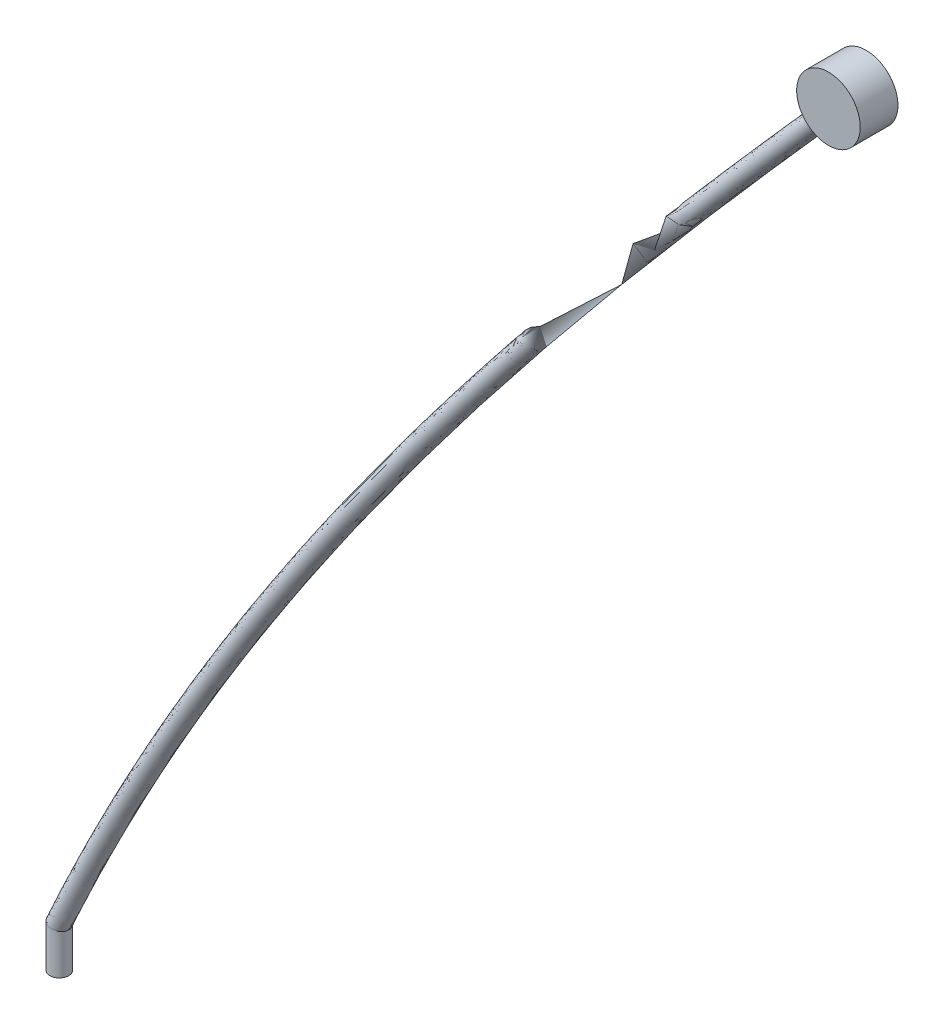
ISO-10303-21;
HEADER;
FILE_DESCRIPTION(('STEP AP214'),'2;1');
FILE_NAME('part.step','',(''),(''),'','','');
FILE_SCHEMA(('AUTOMOTIVE_DESIGN { 1 0 10303 214 1 1 1 1 }'));
ENDSEC;
DATA;
#1=APPLICATION_CONTEXT('core data for automotive mechanical design processes');
#2=APPLICATION_PROTOCOL_DEFINITION('international standard','automotive_design',2000,#1);
#3=PRODUCT_CONTEXT('',#1,'mechanical');
#4=PRODUCT('Part','Part','',(#3));
#5=PRODUCT_RELATED_PRODUCT_CATEGORY('part','',(#4));
#6=PRODUCT_DEFINITION_FORMATION('','',#4);
#7=PRODUCT_DEFINITION_CONTEXT('part definition',#1,'design');
#8=PRODUCT_DEFINITION('design','',#6,#7);
#9=PRODUCT_DEFINITION_SHAPE('','',#8);
#10=(LENGTH_UNIT() NAMED_UNIT(*) SI_UNIT(.MILLI.,.METRE.));
#11=(NAMED_UNIT(*) PLANE_ANGLE_UNIT() SI_UNIT($,.RADIAN.));
#12=(NAMED_UNIT(*) SI_UNIT($,.STERADIAN.) SOLID_ANGLE_UNIT());
#13=UNCERTAINTY_MEASURE_WITH_UNIT(LENGTH_MEASURE(1.E-05),#10,'distance_accuracy_value','');
#14=(GEOMETRIC_REPRESENTATION_CONTEXT(3) GLOBAL_UNCERTAINTY_ASSIGNED_CONTEXT((#13)) GLOBAL_UNIT_ASSIGNED_CONTEXT((#10,
#11,#12)) REPRESENTATION_CONTEXT('',''));
#15=CARTESIAN_POINT('',(0.,0.,0.));
#16=DIRECTION('',(0.,0.,1.));
#17=DIRECTION('',(1.,0.,0.));
#18=AXIS2_PLACEMENT_3D('',#15,#16,#17);
#19=CARTESIAN_POINT('',(0.364982395747233,-0.40582418897489,0.));
#20=CARTESIAN_POINT('',(0.395112045346233,-0.339378505646708,0.));
#21=CARTESIAN_POINT('',(0.425299373130601,-0.272805285519978,0.));
#22=CARTESIAN_POINT('',(2.8912381570119,5.16536460882118,0.));
#23=CARTESIAN_POINT('',(5.67835668781732,10.3421385702397,0.));
#24=CARTESIAN_POINT('',(11.8051688985683,20.4175561670656,0.));
#25=CARTESIAN_POINT('',(15.1401645123964,25.3058525147053,0.));
#26=CARTESIAN_POINT('',(25.691584849806,39.597036609414,0.));
#27=CARTESIAN_POINT('',(33.4545155288597,48.625971156513,0.));
#28=CARTESIAN_POINT('',(41.2279620924617,57.3565721666016,0.));
#29=CARTESIAN_POINT('',(0.36498239574723,-0.405824188974876,0.999999999999999));
#30=CARTESIAN_POINT('',(0.395112045346229,-0.339378505646694,0.999999999999999));
#31=CARTESIAN_POINT('',(0.425299373130598,-0.272805285519964,0.999999999999999));
#32=CARTESIAN_POINT('',(2.8912381570119,5.16536460882119,0.999999999999999));
#33=CARTESIAN_POINT('',(5.67835668781732,10.3421385702397,0.999999999999999));
#34=CARTESIAN_POINT('',(11.8051688985683,20.4175561670656,0.999999999999999));
#35=CARTESIAN_POINT('',(15.1401645123964,25.3058525147053,0.999999999999999));
#36=CARTESIAN_POINT('',(25.691584849806,39.597036609414,0.999999999999999));
#37=CARTESIAN_POINT('',(33.4545155288597,48.625971156513,0.999999999999999));
#38=CARTESIAN_POINT('',(41.2279620924617,57.3565721666016,0.999999999999999));
#39=CARTESIAN_POINT('',(-0.545760293342953,0.00715008899987435,0.999999999999999));
#40=CARTESIAN_POINT('',(-0.515630643743954,0.0735957723280567,0.999999999999999));
#41=CARTESIAN_POINT('',(-0.485558923687537,0.139914042390566,0.999999999999999));
#42=CARTESIAN_POINT('',(1.98985983661907,5.59899015676793,0.999999999999999));
#43=CARTESIAN_POINT('',(4.80573824831753,10.8317945789587,0.999999999999999));
#44=CARTESIAN_POINT('',(10.9689346025964,20.9670451571175,0.999999999999999));
#45=CARTESIAN_POINT('',(14.3209302517658,25.8798486066753,0.999999999999999));
#46=CARTESIAN_POINT('',(24.9165865728638,40.2309473448191,0.999999999999999));
#47=CARTESIAN_POINT('',(32.6998441616535,49.2821792741472,0.999999999999999));
#48=CARTESIAN_POINT('',(40.481101513256,58.0215528243869,0.999999999999999));
#49=CARTESIAN_POINT('',(-0.545760293342953,0.00715008899987435,0.));
#50=CARTESIAN_POINT('',(-0.515630643743954,0.0735957723280567,0.));
#51=CARTESIAN_POINT('',(-0.485558923687537,0.139914042390566,0.));
#52=CARTESIAN_POINT('',(1.98985983661907,5.59899015676793,0.));
#53=CARTESIAN_POINT('',(4.80573824831753,10.8317945789587,0.));
#54=CARTESIAN_POINT('',(10.9689346025964,20.9670451571175,0.));
#55=CARTESIAN_POINT('',(14.3209302517658,25.8798486066753,0.));
#56=CARTESIAN_POINT('',(24.9165865728638,40.2309473448191,0.));
#57=CARTESIAN_POINT('',(32.6998441616535,49.2821792741472,0.));
#58=CARTESIAN_POINT('',(40.481101513256,58.0215528243869,0.));
#59=CARTESIAN_POINT('',(-0.545760293342953,0.00715008899987435,-0.999999999999999));
#60=CARTESIAN_POINT('',(-0.515630643743954,0.0735957723280567,-0.999999999999999));
#61=CARTESIAN_POINT('',(-0.485558923687537,0.139914042390566,-0.999999999999999));
#62=CARTESIAN_POINT('',(1.98985983661907,5.59899015676793,-0.999999999999999));
#63=CARTESIAN_POINT('',(4.80573824831753,10.8317945789587,-0.999999999999999));
#64=CARTESIAN_POINT('',(10.9689346025964,20.9670451571175,-0.999999999999999));
#65=CARTESIAN_POINT('',(14.3209302517658,25.8798486066753,-0.999999999999999));
#66=CARTESIAN_POINT('',(24.9165865728638,40.2309473448191,-0.999999999999999));
#67=CARTESIAN_POINT('',(32.6998441616535,49.2821792741472,-0.999999999999999));
#68=CARTESIAN_POINT('',(40.481101513256,58.0215528243869,-0.999999999999999));
#69=CARTESIAN_POINT('',(0.36498239574723,-0.405824188974876,-0.999999999999999));
#70=CARTESIAN_POINT('',(0.395112045346229,-0.339378505646694,-0.999999999999999));
#71=CARTESIAN_POINT('',(0.425299373130598,-0.272805285519964,-0.999999999999999));
#72=CARTESIAN_POINT('',(2.8912381570119,5.16536460882119,-0.999999999999999));
#73=CARTESIAN_POINT('',(5.67835668781732,10.3421385702397,-0.999999999999999));
#74=CARTESIAN_POINT('',(11.8051688985683,20.4175561670656,-0.999999999999999));
#75=CARTESIAN_POINT('',(15.1401645123964,25.3058525147053,-0.999999999999999));
#76=CARTESIAN_POINT('',(25.691584849806,39.597036609414,-0.999999999999999));
#77=CARTESIAN_POINT('',(33.4545155288597,48.625971156513,-0.999999999999999));
#78=CARTESIAN_POINT('',(41.2279620924617,57.3565721666016,-0.999999999999999));
#79=CARTESIAN_POINT('',(0.364982395747233,-0.40582418897489,0.));
#80=CARTESIAN_POINT('',(0.395112045346233,-0.339378505646708,0.));
#81=CARTESIAN_POINT('',(0.425299373130601,-0.272805285519978,0.));
#82=CARTESIAN_POINT('',(2.8912381570119,5.16536460882118,0.));
#83=CARTESIAN_POINT('',(5.67835668781732,10.3421385702397,0.));
#84=CARTESIAN_POINT('',(11.8051688985683,20.4175561670656,0.));
#85=CARTESIAN_POINT('',(15.1401645123964,25.3058525147053,0.));
#86=CARTESIAN_POINT('',(25.691584849806,39.597036609414,0.));
#87=CARTESIAN_POINT('',(33.4545155288597,48.625971156513,0.));
#88=CARTESIAN_POINT('',(41.2279620924617,57.3565721666016,0.));
#89=(BOUNDED_SURFACE() B_SPLINE_SURFACE(3,3,((#19,#20,#21,#22,#23,#24,#25,#26,#27,#28),(#29,#30,
#31,#32,#33,#34,#35,#36,#37,#38),(#39,#40,#41,#42,#43,#44,#45,#46,#47,#48),(#49,#50,#51,#52,#53,
#54,#55,#56,#57,#58),(#59,#60,#61,#62,#63,#64,#65,#66,#67,#68),(#69,#70,#71,#72,#73,#74,#75,#76,
#77,#78),(#79,#80,#81,#82,#83,#84,#85,#86,#87,#88)),.UNSPECIFIED.,.T.,.F.,
.F.) B_SPLINE_SURFACE_WITH_KNOTS((4,3,4),(4,2,2,2,4),(0.,0.5,1.),(-0.0030863727093565,0.,0.25,
0.5,1.),.UNSPECIFIED.) GEOMETRIC_REPRESENTATION_ITEM() RATIONAL_B_SPLINE_SURFACE(((1.,1.,1.,1.,
1.,1.,1.,1.,1.,1.),(0.333333333333333,0.333333333333333,0.333333333333333,0.333333333333333,
0.333333333333333,0.333333333333333,0.333333333333333,0.333333333333333,0.333333333333333,
0.333333333333333),(0.333333333333333,0.333333333333333,0.333333333333333,0.333333333333333,
0.333333333333333,0.333333333333333,0.333333333333333,0.333333333333333,0.333333333333333,
0.333333333333333),(1.,1.,1.,1.,1.,1.,1.,1.,1.,1.),(0.333333333333333,0.333333333333333,
0.333333333333333,0.333333333333333,0.333333333333333,0.333333333333333,0.333333333333333,
0.333333333333333,0.333333333333333,0.333333333333333),(0.333333333333333,0.333333333333333,
0.333333333333333,0.333333333333333,0.333333333333333,0.333333333333333,0.333333333333333,
0.333333333333333,0.333333333333333,0.333333333333333),(1.,1.,1.,1.,1.,1.,1.,1.,1.,1.))) REPRESENTATION_ITEM('') SURFACE());
#90=CARTESIAN_POINT('',(0.,0.,0.500000000001431));
#91=CARTESIAN_POINT('',(0.00226707309540748,-0.000489991174305248,0.500000072405041));
#92=CARTESIAN_POINT('',(0.00453449283708607,-0.000980064064672274,0.499984643599178));
#93=CARTESIAN_POINT('',(0.0353262670399985,-0.00763539198243149,0.499564859094889));
#94=CARTESIAN_POINT('',(0.0638685566523301,-0.0138055863226504,0.496725695908079));
#95=CARTESIAN_POINT('',(0.120138994793379,-0.0259720205120058,0.486199140954245));
#96=CARTESIAN_POINT('',(0.147864741919027,-0.0319677467417633,0.478498703884598));
#97=CARTESIAN_POINT('',(0.20163812098245,-0.0435981424770569,0.458436593094061));
#98=CARTESIAN_POINT('',(0.227687146609348,-0.0492331118217756,0.446078850661567));
#99=CARTESIAN_POINT('',(0.277355471479613,-0.0599789860279012,0.417015555479136));
#100=CARTESIAN_POINT('',(0.300974837806577,-0.0650899053584683,0.400310122815166));
#101=CARTESIAN_POINT('',(0.344815226105173,-0.0745775624690747,0.363204971243007));
#102=CARTESIAN_POINT('',(0.365071210755604,-0.0789618526034719,0.342848531191479));
#103=CARTESIAN_POINT('',(0.401865980078131,-0.0869266633139862,0.298873640245993));
#104=CARTESIAN_POINT('',(0.418404736013341,-0.0905071776763307,0.275255164136399));
#105=CARTESIAN_POINT('',(0.446902768579719,-0.0966772423419892,0.225986614042604));
#106=CARTESIAN_POINT('',(0.458954956419504,-0.0992868971112703,0.200392800099975));
#107=CARTESIAN_POINT('',(0.478590165448919,-0.103538694817086,0.147470886660199));
#108=CARTESIAN_POINT('',(0.486173981154404,-0.105181009755131,0.120143096437067));
#109=CARTESIAN_POINT('',(0.496516486501445,-0.107420772352116,0.0651128219068558));
#110=CARTESIAN_POINT('',(0.49936814545768,-0.108038352226586,0.0374286007607485));
#111=CARTESIAN_POINT('',(0.500443741879226,-0.108271290135199,-0.0180329837929313));
#112=CARTESIAN_POINT('',(0.498667986604909,-0.107886714712469,-0.0458103408939613));
#113=CARTESIAN_POINT('',(0.49058614876623,-0.1061364978166,-0.100396094955726));
#114=CARTESIAN_POINT('',(0.48432295380948,-0.104780143881365,-0.127211159961443));
#115=CARTESIAN_POINT('',(0.467502683906434,-0.101137787802182,-0.179428623333339));
#116=CARTESIAN_POINT('',(0.456940137718043,-0.0988506011053216,-0.204829174629402));
#117=CARTESIAN_POINT('',(0.431782848074148,-0.0934035840206285,-0.253615451770295));
#118=CARTESIAN_POINT('',(0.417167164274479,-0.0902392217812983,-0.276989863342));
#119=CARTESIAN_POINT('',(0.3843696941045,-0.0831391996086027,-0.320955506040982));
#120=CARTESIAN_POINT('',(0.366187226142587,-0.0792033922567027,-0.341546203944506));
#121=CARTESIAN_POINT('',(0.325959075259248,-0.0704966567994486,-0.380211923033232));
#122=CARTESIAN_POINT('',(0.303783613268806,-0.0656976832307296,-0.398145692980047));
#123=CARTESIAN_POINT('',(0.256835399037275,-0.0555391843062348,-0.429928170919214));
#124=CARTESIAN_POINT('',(0.232065808319461,-0.0501803412949274,-0.443781774744548));
#125=CARTESIAN_POINT('',(0.180595469633831,-0.0390466523006823,-0.467102780008738));
#126=CARTESIAN_POINT('',(0.153892349546751,-0.0332712953602621,-0.476564684438503));
#127=CARTESIAN_POINT('',(0.0993706210755428,-0.0214813191496408,-0.490832791100767));
#128=CARTESIAN_POINT('',(0.0715545429440592,-0.0154672428184169,-0.495648991300531));
#129=CARTESIAN_POINT('',(0.0313368419418847,-0.00677331325050328,-0.499168613282706));
#130=CARTESIAN_POINT('',(0.0190719172800046,-0.0041221796080593,-0.499786865113168));
#131=CARTESIAN_POINT('',(0.00453479652511433,-0.000980129787771206,-0.499984563636802));
#132=CARTESIAN_POINT('',(0.00226739685336549,-0.000490061245780275,-0.499999984997572));
#133=CARTESIAN_POINT('',(0.,0.,-0.499999999999999));
#134=B_SPLINE_CURVE_WITH_KNOTS('',3,(#90,#91,#92,#93,#94,#95,#96,#97,#98,#99,#100,#101,#102,
#103,#104,#105,#106,#107,#108,#109,#110,#111,#112,#113,#114,#115,#116,#117,#118,#119,#120,#121,
#122,#123,#124,#125,#126,#127,#128,#129,#130,#131,#132,#133),.UNSPECIFIED.,.F.,.F.,(4,2,2,2,2,2,
2,2,2,2,2,2,2,2,2,2,2,2,2,2,2,4),(0.,0.00695924581571971,0.0945024614478272,0.182281605095308,
0.269986818651063,0.357689609990111,0.44441428437397,0.531139629179677,0.615953246078725,
0.700751777816359,0.783863707877603,0.866970119446093,0.949292678902069,1.03172032906815,
1.114582036949,1.19745959467,1.28380376282948,1.37004389964763,1.4563916924716,1.54255323983208,
1.58021557702554,1.58717482284124),.UNSPECIFIED.);
#135=CARTESIAN_POINT('',(0.,0.,0.500000000001431));
#136=VERTEX_POINT('',#135);
#137=CARTESIAN_POINT('',(0.,0.,-0.499999999999999));
#138=VERTEX_POINT('',#137);
#139=EDGE_CURVE('E65',#136,#138,#134,.T.);
#140=CARTESIAN_POINT('',(0.,0.,0.500000000001431));
#141=CARTESIAN_POINT('',(-0.00226707305205023,0.000489991256009299,0.500000072406046));
#142=CARTESIAN_POINT('',(-0.00453449418943711,0.000980057713874616,0.499984643599505));
#143=CARTESIAN_POINT('',(-0.0353246255558441,0.00763484690246679,0.499564881238525));
#144=CARTESIAN_POINT('',(-0.0638654914850749,0.0138034888695218,0.49672602013765));
#145=CARTESIAN_POINT('',(-0.120133582713246,0.0259649096496203,0.486200403657524));
#146=CARTESIAN_POINT('',(-0.147858408435456,0.0319571698117338,0.478500606208539));
#147=CARTESIAN_POINT('',(-0.201630434494709,0.0435790931005818,0.45843992048553));
#148=CARTESIAN_POINT('',(-0.227679024536104,0.0492090565940159,0.446082953137491));
#149=CARTESIAN_POINT('',(-0.277346754656793,0.0599438945649421,0.417021306119827));
#150=CARTESIAN_POINT('',(-0.300965961970629,0.0650487835741682,0.400316746817468));
#151=CARTESIAN_POINT('',(-0.344805544886219,0.0745239592797745,0.363214042984287));
#152=CARTESIAN_POINT('',(-0.365060973474595,0.0789018221127328,0.342859289561876));
#153=CARTESIAN_POINT('',(-0.401855030536631,0.0868542237444404,0.298888201893799));
#154=CARTESIAN_POINT('',(-0.418393629457257,0.0904287561557967,0.275271841717051));
#155=CARTESIAN_POINT('',(-0.446892468318249,0.0965882870466732,0.226006888313825));
#156=CARTESIAN_POINT('',(-0.458945440735978,0.0991933280652912,0.200414445110942));
#157=CARTESIAN_POINT('',(-0.478582550819893,0.10343754868261,0.147495406939639));
#158=CARTESIAN_POINT('',(-0.486167479625031,0.105076899272327,0.120169119925906));
#159=CARTESIAN_POINT('',(-0.496513060356699,0.107312916768309,0.0651394448933885));
#160=CARTESIAN_POINT('',(-0.499366284389822,0.107929591528115,0.0374542445433262));
#161=CARTESIAN_POINT('',(-0.500444649316689,0.108162661358243,-0.0180095316786568));
#162=CARTESIAN_POINT('',(-0.498670095984306,0.107779122516271,-0.045788101260218));
#163=CARTESIAN_POINT('',(-0.490590029381218,0.106032756558232,-0.100377797498431));
#164=CARTESIAN_POINT('',(-0.484327200631495,0.104679154959812,-0.127195557424292));
#165=CARTESIAN_POINT('',(-0.467506732232179,0.10104370271524,-0.179418476111047));
#166=CARTESIAN_POINT('',(-0.456943620449263,0.0987606693621717,-0.204821787984074));
#167=CARTESIAN_POINT('',(-0.431784651279192,0.0933229939213385,-0.253612590864087));
#168=CARTESIAN_POINT('',(-0.417167986403914,0.0901638546521518,-0.276988841271909));
#169=CARTESIAN_POINT('',(-0.384367856553433,0.0830746725373641,-0.320957889265509));
#170=CARTESIAN_POINT('',(-0.366183712303423,0.0791444828779905,-0.341550155496575));
#171=CARTESIAN_POINT('',(-0.32595436314264,0.0704495993161229,-0.38021585394337));
#172=CARTESIAN_POINT('',(-0.303779803880573,0.0656569475951832,-0.398148500275765));
#173=CARTESIAN_POINT('',(-0.256833698940574,0.0555103459049033,-0.429929093605291));
#174=CARTESIAN_POINT('',(-0.2320653149947,0.0501570792947539,-0.443781936878698));
#175=CARTESIAN_POINT('',(-0.180597802425912,0.0390332426424097,-0.467101784529647));
#176=CARTESIAN_POINT('',(-0.15389630481054,0.0332621605755472,-0.476563298534848));
#177=CARTESIAN_POINT('',(-0.0993782373037308,0.0214789848411649,-0.490831147529158));
#178=CARTESIAN_POINT('',(-0.0715641957135297,0.0154674376395783,-0.495647475433548));
#179=CARTESIAN_POINT('',(-0.0313447331852587,0.00677465659993984,-0.499168216677797));
#180=CARTESIAN_POINT('',(-0.0190758453263779,0.00412293569915535,-0.499786811538001));
#181=CARTESIAN_POINT('',(-0.00453479783879459,0.00098012333922108,-0.499984563647621));
#182=CARTESIAN_POINT('',(-0.00226739676534561,0.000490061219310344,-0.499999985011168));
#183=CARTESIAN_POINT('',(0.,0.,-0.499999999999999));
#184=B_SPLINE_CURVE_WITH_KNOTS('',3,(#140,#141,#142,#143,#144,#145,#146,#147,#148,#149,#150,
#151,#152,#153,#154,#155,#156,#157,#158,#159,#160,#161,#162,#163,#164,#165,#166,#167,#168,#169,
#170,#171,#172,#173,#174,#175,#176,#177,#178,#179,#180,#181,#182,#183),.UNSPECIFIED.,.F.,.F.,(4,
2,2,2,2,2,2,2,2,2,2,2,2,2,2,2,2,2,2,2,2,4),(0.,0.00695924581606862,0.0944973022654268,
0.18227123054532,0.269971425406888,0.357669192462419,0.444386306950925,0.531104110914979,
0.615913824531295,0.700708516706958,0.783823805009007,0.866933601724545,0.949263318995916,
1.03169813038595,1.11456418429612,1.19744603186437,1.28378293365752,1.37001579409575,
1.45635618086233,1.54251041158751,1.58018474572976,1.58714399154581),.UNSPECIFIED.);
#185=EDGE_CURVE('E52',#136,#138,#184,.T.);
#186=CARTESIAN_POINT('',(41.1056649435145,57.2191906785409,0.));
#187=CARTESIAN_POINT('',(41.1056644542059,57.2191906968581,-0.0273780721169887));
#188=CARTESIAN_POINT('',(41.1034990858306,57.2201511149894,-0.0547598950276152));
#189=CARTESIAN_POINT('',(41.0949583533653,57.2240035249723,-0.108723063917075));
#190=CARTESIAN_POINT('',(41.0885814909199,57.2268962042836,-0.135304121480889));
#191=CARTESIAN_POINT('',(41.0719788609571,57.2346331900334,-0.18685334511065));
#192=CARTESIAN_POINT('',(41.0617629473254,57.2394725021722,-0.211825450335861));
#193=CARTESIAN_POINT('',(41.0379441072926,57.2511569916701,-0.259643938096179));
#194=CARTESIAN_POINT('',(41.02433487395,57.2580059083879,-0.282486252272979));
#195=CARTESIAN_POINT('',(40.9938677728164,57.2739845970694,-0.326083429069457));
#196=CARTESIAN_POINT('',(40.9769266311537,57.2831751437769,-0.346757837399197));
#197=CARTESIAN_POINT('',(40.940768749941,57.3037403966999,-0.384681907563666));
#198=CARTESIAN_POINT('',(40.92155584879,57.3151114383765,-0.401937217976646));
#199=CARTESIAN_POINT('',(40.8810696931261,57.3403069810357,-0.432960230231678));
#200=CARTESIAN_POINT('',(40.8597593380559,57.354181693166,-0.446639039074481));
#201=CARTESIAN_POINT('',(40.8162512365142,57.3840555820658,-0.469542418275805));
#202=CARTESIAN_POINT('',(40.7940536748266,57.4000543180467,-0.478767910973036));
#203=CARTESIAN_POINT('',(40.750188890828,57.4334087561408,-0.492246121521416));
#204=CARTESIAN_POINT('',(40.7285239827471,57.4507146823853,-0.496629331992345));
#205=CARTESIAN_POINT('',(40.6858329179264,57.4866151075294,-0.500706584916919));
#206=CARTESIAN_POINT('',(40.664806624764,57.5052093283954,-0.500401636027677));
#207=CARTESIAN_POINT('',(40.6246925185349,57.5424951729541,-0.495198973229204));
#208=CARTESIAN_POINT('',(40.6055639464633,57.5611640651034,-0.490450584037033));
#209=CARTESIAN_POINT('',(40.5689590723309,57.5985690512449,-0.476735530280499));
#210=CARTESIAN_POINT('',(40.5514828615771,57.6173051488914,-0.467768632771212));
#211=CARTESIAN_POINT('',(40.5183631171216,57.6543725152405,-0.445799676776615));
#212=CARTESIAN_POINT('',(40.5027374098908,57.6726986515916,-0.432762178311709));
#213=CARTESIAN_POINT('',(40.4736819199653,57.7081510163674,-0.403024404930394));
#214=CARTESIAN_POINT('',(40.4602563971213,57.7252748812532,-0.386317167849295));
#215=CARTESIAN_POINT('',(40.435292054823,57.7582496767009,-0.348998946091433));
#216=CARTESIAN_POINT('',(40.4238415974065,57.7740299122324,-0.328266233485859));
#217=CARTESIAN_POINT('',(40.403535321186,57.8028677085852,-0.283904824134209));
#218=CARTESIAN_POINT('',(40.3946750339151,57.8159299470371,-0.260281215767985));
#219=CARTESIAN_POINT('',(40.3794632929578,57.8388671897316,-0.210436516656102));
#220=CARTESIAN_POINT('',(40.3731406109566,57.8487054222433,-0.184189633396885));
#221=CARTESIAN_POINT('',(40.3631640946166,57.8644448881386,-0.130060262458129));
#222=CARTESIAN_POINT('',(40.3595094572152,57.8703473061282,-0.102178269666998));
#223=CARTESIAN_POINT('',(40.354958104228,57.8777265986478,-0.0466016143041953));
#224=CARTESIAN_POINT('',(40.3539705002046,57.8793492735077,-0.018933737839149));
#225=CARTESIAN_POINT('',(40.3544945968888,57.8784930216059,0.0363123011586006));
#226=CARTESIAN_POINT('',(40.3560059678998,57.8760146359084,0.0638904750450481));
#227=CARTESIAN_POINT('',(40.361452639912,57.8672192764264,0.117460065293797));
#228=CARTESIAN_POINT('',(40.3653264618432,57.8609997152129,0.143473908913227));
#229=CARTESIAN_POINT('',(40.3754401832172,57.8451298786323,0.193986648151446));
#230=CARTESIAN_POINT('',(40.3816835413193,57.8354745896467,0.218483268087144));
#231=CARTESIAN_POINT('',(40.3967051912521,57.8129284352452,0.26589683538281));
#232=CARTESIAN_POINT('',(40.4055420853418,57.7999637914731,0.288760072017979));
#233=CARTESIAN_POINT('',(40.4256607844778,57.7715117093883,0.331668901720124));
#234=CARTESIAN_POINT('',(40.4369430240742,57.7560238228044,0.35171399294335));
#235=CARTESIAN_POINT('',(40.4623450947247,57.7225681738747,0.389153204947659));
#236=CARTESIAN_POINT('',(40.4765518009347,57.7045316514183,0.406427234733241));
#237=CARTESIAN_POINT('',(40.5073734467026,57.6671918254768,0.436912808394147));
#238=CARTESIAN_POINT('',(40.5239845933864,57.6478905428496,0.450130650090298));
#239=CARTESIAN_POINT('',(40.5592385799469,57.6089023734117,0.472034270829429));
#240=CARTESIAN_POINT('',(40.5778642543489,57.5892197610821,0.480755175925021));
#241=CARTESIAN_POINT('',(40.6168489769976,57.5500567241569,0.49351416745355));
#242=CARTESIAN_POINT('',(40.6372075487555,57.5305762456234,0.497553536716007));
#243=CARTESIAN_POINT('',(40.6783210787653,57.4931994567102,0.500743165308249));
#244=CARTESIAN_POINT('',(40.6990335934743,57.4752712079527,0.500068565798384));
#245=CARTESIAN_POINT('',(40.7409315218505,57.4407391113102,0.494271015580272));
#246=CARTESIAN_POINT('',(40.7621169139918,57.4241352032967,0.489148266955334));
#247=CARTESIAN_POINT('',(40.804084123984,57.3927797086576,0.474706446249515));
#248=CARTESIAN_POINT('',(40.8248678638034,57.3780120309432,0.465427680724019));
#249=CARTESIAN_POINT('',(40.8656073960581,57.3503488245773,0.442957222946884));
#250=CARTESIAN_POINT('',(40.885561589115,57.3374568025828,0.429758338355799));
#251=CARTESIAN_POINT('',(40.9245638166262,57.3133062755121,0.399340094080842));
#252=CARTESIAN_POINT('',(40.9435626879251,57.302112943571,0.382005983886));
#253=CARTESIAN_POINT('',(40.9792576959693,57.2818937392862,0.344018966177415));
#254=CARTESIAN_POINT('',(40.9959535699814,57.2728681141542,0.323365680582893));
#255=CARTESIAN_POINT('',(41.0268304245208,57.2567233517547,0.278605719022536));
#256=CARTESIAN_POINT('',(41.0409248111022,57.2496668286222,0.254416510061406));
#257=CARTESIAN_POINT('',(41.0653196732779,57.2377644972492,0.203700113265614));
#258=CARTESIAN_POINT('',(41.0756221155679,57.2329175427018,0.177174146265735));
#259=CARTESIAN_POINT('',(41.090946505852,57.2258191637818,0.125717096430823));
#260=CARTESIAN_POINT('',(41.0964430793055,57.2233315131873,0.100959075305072));
#261=CARTESIAN_POINT('',(41.1038021369511,57.2200174395185,0.0508016869954763));
#262=CARTESIAN_POINT('',(41.1056653975143,57.2191906615454,0.0254024580010222));
#263=CARTESIAN_POINT('',(41.1056649435145,57.2191906785409,0.));
#264=B_SPLINE_CURVE_WITH_KNOTS('',3,(#186,#187,#188,#189,#190,#191,#192,#193,#194,#195,#196,
#197,#198,#199,#200,#201,#202,#203,#204,#205,#206,#207,#208,#209,#210,#211,#212,#213,#214,#215,
#216,#217,#218,#219,#220,#221,#222,#223,#224,#225,#226,#227,#228,#229,#230,#231,#232,#233,#234,
#235,#236,#237,#238,#239,#240,#241,#242,#243,#244,#245,#246,#247,#248,#249,#250,#251,#252,#253,
#254,#255,#256,#257,#258,#259,#260,#261,#262,#263),.UNSPECIFIED.,.T.,.F.,(4,2,2,2,2,2,2,2,2,2,2,
2,2,2,2,2,2,2,2,2,2,2,2,2,2,2,2,2,2,2,2,2,2,2,2,2,2,2,4),(0.,0.0820404196112274,
0.164110043107499,0.245970437434808,0.327984129513823,0.4123932070619,0.496661650696637,
0.582859406454833,0.669039301887834,0.752835386734081,0.836613443111711,0.917673475871596,
0.998737985270709,1.08052893339895,1.16247641518659,1.24746091648254,1.33229792851457,
1.41807136098753,1.50381896560793,1.58660519558352,1.66938050421561,1.7500885425712,
1.83091484116542,1.91373023299066,1.99656035361137,2.08234556308718,2.16799689668431,
2.25296865855257,2.33791713103895,2.41972669252795,2.50153253753135,2.5825616241733,
2.66374030505155,2.74750676425363,2.83128277190104,2.91747915895308,3.00363077695564,
3.0797673933909,3.15588773906956),.UNSPECIFIED.);
#265=CARTESIAN_POINT('',(41.1056649435145,57.2191906785409,0.));
#266=VERTEX_POINT('',#265);
#267=EDGE_CURVE('E12',#266,#266,#264,.T.);
#268=ORIENTED_EDGE('',*,*,#139,.T.);
#269=ORIENTED_EDGE('',*,*,#185,.F.);
#270=EDGE_LOOP('',(#268,#269));
#271=FACE_BOUND('',#270,.T.);
#272=ORIENTED_EDGE('',*,*,#267,.F.);
#273=EDGE_LOOP('',(#272));
#274=FACE_BOUND('',#273,.T.);
#275=ADVANCED_FACE('F41',(#271,#274),#89,.F.);
#276=CARTESIAN_POINT('',(0.,-2.21220858257555,0.));
#277=DIRECTION('',(0.,-1.,0.));
#278=DIRECTION('',(1.,0.,0.));
#279=AXIS2_PLACEMENT_3D('',#276,#277,#278);
#280=PLANE('',#279);
#281=CARTESIAN_POINT('',(0.,-2.21220858257555,0.));
#282=DIRECTION('',(0.,-1.,0.));
#283=DIRECTION('',(1.,0.,0.));
#284=AXIS2_PLACEMENT_3D('',#281,#282,#283);
#285=CIRCLE('',#284,0.499999999999999);
#286=CARTESIAN_POINT('',(0.500000000000013,-2.21220858257555,0.));
#287=VERTEX_POINT('',#286);
#288=EDGE_CURVE('E57',#287,#287,#285,.T.);
#289=ORIENTED_EDGE('',*,*,#288,.T.);
#290=EDGE_LOOP('',(#289));
#291=FACE_BOUND('',#290,.T.);
#292=ADVANCED_FACE('F43',(#291),#280,.T.);
#293=CARTESIAN_POINT('',(0.,-2.21220858257555,0.));
#294=DIRECTION('',(0.,1.,0.));
#295=DIRECTION('',(0.,0.,1.));
#296=AXIS2_PLACEMENT_3D('',#293,#294,#295);
#297=CYLINDRICAL_SURFACE('',#296,0.499999999999999);
#298=ORIENTED_EDGE('',*,*,#185,.T.);
#299=ORIENTED_EDGE('',*,*,#139,.F.);
#300=EDGE_LOOP('',(#298,#299));
#301=FACE_BOUND('',#300,.T.);
#302=ORIENTED_EDGE('',*,*,#288,.F.);
#303=EDGE_LOOP('',(#302));
#304=FACE_BOUND('',#303,.T.);
#305=ADVANCED_FACE('F66',(#301,#304),#297,.T.);
#306=CARTESIAN_POINT('',(41.7925773167411,58.7593888728151,1.));
#307=DIRECTION('',(0.,0.,-1.));
#308=DIRECTION('',(-1.,0.,0.));
#309=AXIS2_PLACEMENT_3D('',#306,#307,#308);
#310=CYLINDRICAL_SURFACE('',#309,1.68643383686921);
#311=CARTESIAN_POINT('',(41.7925773167411,58.7593888728151,-1.));
#312=DIRECTION('',(0.,0.,1.));
#313=DIRECTION('',(1.,0.,0.));
#314=AXIS2_PLACEMENT_3D('',#311,#312,#313);
#315=CIRCLE('',#314,1.68643383686921);
#316=CARTESIAN_POINT('',(43.4790111536103,58.7593888728151,-1.));
#317=VERTEX_POINT('',#316);
#318=EDGE_CURVE('E125',#317,#317,#315,.T.);
#319=ORIENTED_EDGE('',*,*,#318,.T.);
#320=EDGE_LOOP('',(#319));
#321=FACE_BOUND('',#320,.T.);
#322=CARTESIAN_POINT('',(41.7925773167411,58.7593888728151,1.));
#323=DIRECTION('',(0.,0.,1.));
#324=DIRECTION('',(1.,0.,0.));
#325=AXIS2_PLACEMENT_3D('',#322,#323,#324);
#326=CIRCLE('',#325,1.68643383686921);
#327=CARTESIAN_POINT('',(43.4790111536103,58.7593888728151,1.));
#328=VERTEX_POINT('',#327);
#329=EDGE_CURVE('E126',#328,#328,#326,.T.);
#330=ORIENTED_EDGE('',*,*,#329,.F.);
#331=EDGE_LOOP('',(#330));
#332=FACE_BOUND('',#331,.T.);
#333=ORIENTED_EDGE('',*,*,#267,.T.);
#334=EDGE_LOOP('',(#333));
#335=FACE_BOUND('',#334,.T.);
#336=ADVANCED_FACE('F103',(#321,#332,#335),#310,.T.);
#337=CARTESIAN_POINT('',(41.7925773167411,58.7593888728151,1.));
#338=DIRECTION('',(0.,0.,1.));
#339=DIRECTION('',(1.,0.,0.));
#340=AXIS2_PLACEMENT_3D('',#337,#338,#339);
#341=PLANE('',#340);
#342=ORIENTED_EDGE('',*,*,#329,.T.);
#343=EDGE_LOOP('',(#342));
#344=FACE_BOUND('',#343,.T.);
#345=ADVANCED_FACE('F108',(#344),#341,.T.);
#346=CARTESIAN_POINT('',(41.7925773167411,58.7593888728151,-1.));
#347=DIRECTION('',(0.,0.,1.));
#348=DIRECTION('',(1.,0.,0.));
#349=AXIS2_PLACEMENT_3D('',#346,#347,#348);
#350=PLANE('',#349);
#351=ORIENTED_EDGE('',*,*,#318,.F.);
#352=EDGE_LOOP('',(#351));
#353=FACE_BOUND('',#352,.T.);
#354=ADVANCED_FACE('F113',(#353),#350,.F.);
#355=CLOSED_SHELL('',(#275,#292,#305,#336,#345,#354));
#356=MANIFOLD_SOLID_BREP('B2',#355);
#357=ADVANCED_BREP_SHAPE_REPRESENTATION('',(#18,#356),#14);
#358=SHAPE_DEFINITION_REPRESENTATION(#9,#357);
ENDSEC;
END-ISO-10303-21;
